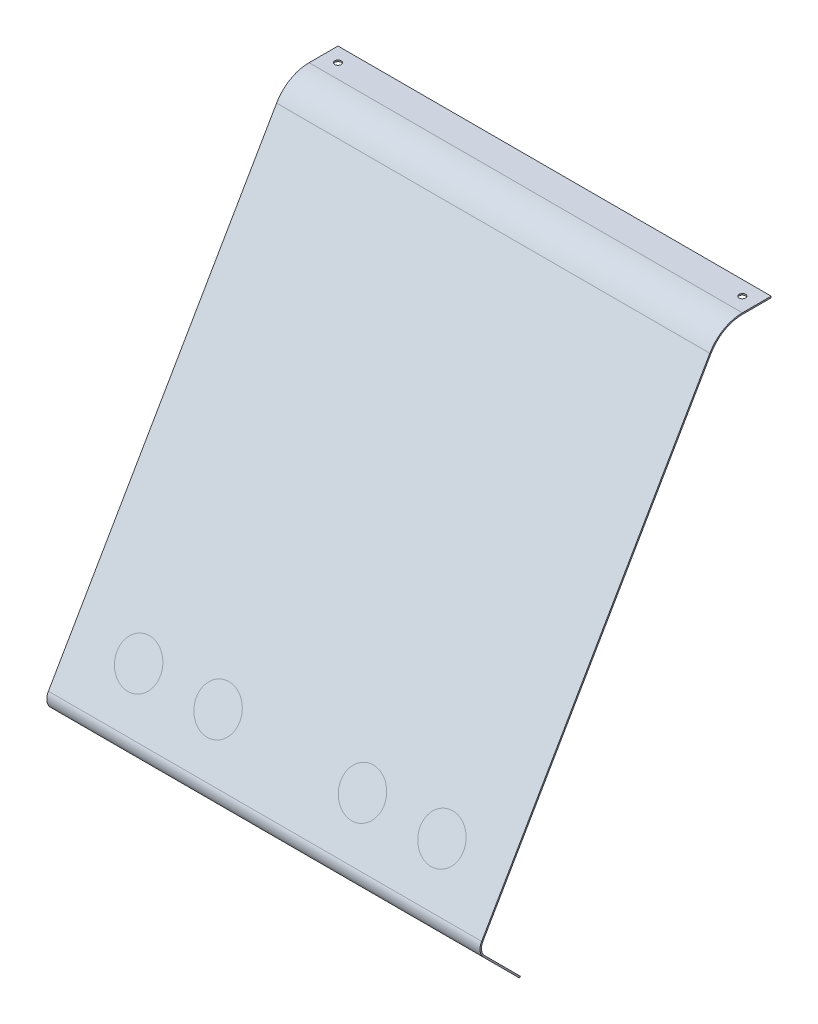
ISO-10303-21;
HEADER;
FILE_DESCRIPTION(('STEP AP214'),'2;1');
FILE_NAME('part.step','',(''),(''),'','','');
FILE_SCHEMA(('AUTOMOTIVE_DESIGN { 1 0 10303 214 1 1 1 1 }'));
ENDSEC;
DATA;
#1=APPLICATION_CONTEXT('core data for automotive mechanical design processes');
#2=APPLICATION_PROTOCOL_DEFINITION('international standard','automotive_design',2000,#1);
#3=PRODUCT_CONTEXT('',#1,'mechanical');
#4=PRODUCT('Part','Part','',(#3));
#5=PRODUCT_RELATED_PRODUCT_CATEGORY('part','',(#4));
#6=PRODUCT_DEFINITION_FORMATION('','',#4);
#7=PRODUCT_DEFINITION_CONTEXT('part definition',#1,'design');
#8=PRODUCT_DEFINITION('design','',#6,#7);
#9=PRODUCT_DEFINITION_SHAPE('','',#8);
#10=(LENGTH_UNIT() NAMED_UNIT(*) SI_UNIT(.MILLI.,.METRE.));
#11=(NAMED_UNIT(*) PLANE_ANGLE_UNIT() SI_UNIT($,.RADIAN.));
#12=(NAMED_UNIT(*) SI_UNIT($,.STERADIAN.) SOLID_ANGLE_UNIT());
#13=UNCERTAINTY_MEASURE_WITH_UNIT(LENGTH_MEASURE(1.E-05),#10,'distance_accuracy_value','');
#14=(GEOMETRIC_REPRESENTATION_CONTEXT(3) GLOBAL_UNCERTAINTY_ASSIGNED_CONTEXT((#13)) GLOBAL_UNIT_ASSIGNED_CONTEXT((#10,
#11,#12)) REPRESENTATION_CONTEXT('',''));
#15=CARTESIAN_POINT('',(0.,0.,0.));
#16=DIRECTION('',(0.,0.,1.));
#17=DIRECTION('',(1.,0.,0.));
#18=AXIS2_PLACEMENT_3D('',#15,#16,#17);
#19=CARTESIAN_POINT('',(0.,68.6719448082336,53.6811732369732));
#20=DIRECTION('',(0.,-0.499999999999998,-0.86602540378444));
#21=DIRECTION('',(0.,0.86602540378444,-0.499999999999998));
#22=AXIS2_PLACEMENT_3D('',#19,#20,#21);
#23=PLANE('',#22);
#24=DIRECTION('',(0.,0.86602540378444,-0.499999999999998));
#25=VECTOR('',#24,1.);
#26=CARTESIAN_POINT('',(600.,68.6719448082336,53.6811732369732));
#27=LINE('',#26,#25);
#28=CARTESIAN_POINT('',(600.,68.6719448082336,53.6811732369732));
#29=VERTEX_POINT('',#28);
#30=CARTESIAN_POINT('',(600.,616.,-262.318826763025));
#31=VERTEX_POINT('',#30);
#32=EDGE_CURVE('E497',#29,#31,#27,.T.);
#33=ORIENTED_EDGE('',*,*,#32,.T.);
#34=DIRECTION('',(1.,0.,0.));
#35=VECTOR('',#34,1.);
#36=CARTESIAN_POINT('',(0.,616.,-262.318826763025));
#37=LINE('',#36,#35);
#38=CARTESIAN_POINT('',(0.,616.,-262.318826763026));
#39=VERTEX_POINT('',#38);
#40=EDGE_CURVE('E498',#39,#31,#37,.T.);
#41=ORIENTED_EDGE('',*,*,#40,.F.);
#42=DIRECTION('',(0.,0.86602540378444,-0.499999999999998));
#43=VECTOR('',#42,1.);
#44=CARTESIAN_POINT('',(0.,68.6719448082336,53.6811732369732));
#45=LINE('',#44,#43);
#46=CARTESIAN_POINT('',(0.,68.6719448082336,53.6811732369732));
#47=VERTEX_POINT('',#46);
#48=EDGE_CURVE('E496',#47,#39,#45,.T.);
#49=ORIENTED_EDGE('',*,*,#48,.F.);
#50=DIRECTION('',(1.,0.,0.));
#51=VECTOR('',#50,1.);
#52=CARTESIAN_POINT('',(0.,68.6719448082336,53.6811732369732));
#53=LINE('',#52,#51);
#54=EDGE_CURVE('E493',#47,#29,#53,.T.);
#55=ORIENTED_EDGE('',*,*,#54,.T.);
#56=EDGE_LOOP('',(#33,#41,#49,#55));
#57=FACE_BOUND('',#56,.T.);
#58=CARTESIAN_POINT('',(90.,129.293723073144,18.6811732369734));
#59=DIRECTION('',(0.,-0.499999999999998,-0.86602540378444));
#60=DIRECTION('',(0.,0.86602540378444,-0.499999999999998));
#61=AXIS2_PLACEMENT_3D('',#58,#59,#60);
#62=CIRCLE('',#61,30.);
#63=CARTESIAN_POINT('',(90.,155.274485186678,3.68117323697342));
#64=VERTEX_POINT('',#63);
#65=EDGE_CURVE('E143',#64,#64,#62,.F.);
#66=ORIENTED_EDGE('',*,*,#65,.F.);
#67=EDGE_LOOP('',(#66));
#68=FACE_BOUND('',#67,.T.);
#69=CARTESIAN_POINT('',(200.,129.293723073144,18.6811732369734));
#70=DIRECTION('',(0.,-0.499999999999998,-0.86602540378444));
#71=DIRECTION('',(0.,0.86602540378444,-0.499999999999998));
#72=AXIS2_PLACEMENT_3D('',#69,#70,#71);
#73=CIRCLE('',#72,30.);
#74=CARTESIAN_POINT('',(200.,155.274485186678,3.68117323697342));
#75=VERTEX_POINT('',#74);
#76=EDGE_CURVE('E179',#75,#75,#73,.F.);
#77=ORIENTED_EDGE('',*,*,#76,.F.);
#78=EDGE_LOOP('',(#77));
#79=FACE_BOUND('',#78,.T.);
#80=CARTESIAN_POINT('',(510.,129.293723073144,18.6811732369734));
#81=DIRECTION('',(0.,-0.499999999999998,-0.86602540378444));
#82=DIRECTION('',(0.,0.86602540378444,-0.499999999999998));
#83=AXIS2_PLACEMENT_3D('',#80,#81,#82);
#84=CIRCLE('',#83,30.0000000000001);
#85=CARTESIAN_POINT('',(510.,155.274485186678,3.68117323697339));
#86=VERTEX_POINT('',#85);
#87=EDGE_CURVE('E63',#86,#86,#84,.F.);
#88=ORIENTED_EDGE('',*,*,#87,.F.);
#89=EDGE_LOOP('',(#88));
#90=FACE_BOUND('',#89,.T.);
#91=CARTESIAN_POINT('',(400.,129.293723073144,18.6811732369737));
#92=DIRECTION('',(0.,-0.499999999999998,-0.86602540378444));
#93=DIRECTION('',(0.,0.86602540378444,-0.499999999999998));
#94=AXIS2_PLACEMENT_3D('',#91,#92,#93);
#95=CIRCLE('',#94,30.0000000000001);
#96=CARTESIAN_POINT('',(400.,155.274485186677,3.68117323697378));
#97=VERTEX_POINT('',#96);
#98=EDGE_CURVE('E11',#97,#97,#95,.F.);
#99=ORIENTED_EDGE('',*,*,#98,.F.);
#100=EDGE_LOOP('',(#99));
#101=FACE_BOUND('',#100,.T.);
#102=ADVANCED_FACE('F53',(#57,#68,#79,#90,#101),#23,.F.);
#103=ORIENTED_EDGE('',*,*,#98,.T.);
#104=EDGE_LOOP('',(#103));
#105=FACE_BOUND('',#104,.T.);
#106=ADVANCED_FACE('F191',(#105),#23,.F.);
#107=ORIENTED_EDGE('',*,*,#87,.T.);
#108=EDGE_LOOP('',(#107));
#109=FACE_BOUND('',#108,.T.);
#110=ADVANCED_FACE('F187',(#109),#23,.F.);
#111=ORIENTED_EDGE('',*,*,#76,.T.);
#112=EDGE_LOOP('',(#111));
#113=FACE_BOUND('',#112,.T.);
#114=ADVANCED_FACE('F201',(#113),#23,.F.);
#115=CARTESIAN_POINT('',(0.,640.,-307.352147759817));
#116=DIRECTION('',(-1.,0.,0.));
#117=DIRECTION('',(0.,0.,-1.));
#118=AXIS2_PLACEMENT_3D('',#115,#116,#117);
#119=PLANE('',#118);
#120=DIRECTION('',(0.,0.,-1.));
#121=VECTOR('',#120,1.);
#122=CARTESIAN_POINT('',(0.,640.,-307.352147759817));
#123=LINE('',#122,#121);
#124=CARTESIAN_POINT('',(0.,640.,-307.352147759817));
#125=VERTEX_POINT('',#124);
#126=CARTESIAN_POINT('',(0.,640.,-347.352147759817));
#127=VERTEX_POINT('',#126);
#128=EDGE_CURVE('E546',#125,#127,#123,.T.);
#129=ORIENTED_EDGE('',*,*,#128,.F.);
#130=CARTESIAN_POINT('',(0.,590.,-307.352147759817));
#131=DIRECTION('',(-1.,0.,0.));
#132=DIRECTION('',(0.,0.,1.));
#133=AXIS2_PLACEMENT_3D('',#130,#131,#132);
#134=CIRCLE('',#133,50.0000000000003);
#135=CARTESIAN_POINT('',(0.,615.,-264.050877570594));
#136=VERTEX_POINT('',#135);
#137=EDGE_CURVE('E466',#136,#125,#134,.T.);
#138=ORIENTED_EDGE('',*,*,#137,.F.);
#139=DIRECTION('',(0.,0.86602540378444,-0.499999999999998));
#140=VECTOR('',#139,1.);
#141=CARTESIAN_POINT('',(0.,67.6719448082336,51.9491224294044));
#142=LINE('',#141,#140);
#143=CARTESIAN_POINT('',(0.,67.6719448082336,51.9491224294044));
#144=VERTEX_POINT('',#143);
#145=EDGE_CURVE('E470',#144,#136,#142,.T.);
#146=ORIENTED_EDGE('',*,*,#145,.F.);
#147=CARTESIAN_POINT('',(0.,60.1719448082336,38.9587413726378));
#148=DIRECTION('',(-1.,0.,0.));
#149=DIRECTION('',(0.,0.,-1.));
#150=AXIS2_PLACEMENT_3D('',#147,#148,#149);
#151=CIRCLE('',#150,15.);
#152=CARTESIAN_POINT('',(0.,49.5653430904353,49.5653430904359));
#153=VERTEX_POINT('',#152);
#154=EDGE_CURVE('E485',#153,#144,#151,.T.);
#155=ORIENTED_EDGE('',*,*,#154,.F.);
#156=DIRECTION('',(0.,0.707106781186543,0.707106781186552));
#157=VECTOR('',#156,1.);
#158=CARTESIAN_POINT('',(0.,0.,0.));
#159=LINE('',#158,#157);
#160=CARTESIAN_POINT('',(0.,0.,0.));
#161=VERTEX_POINT('',#160);
#162=EDGE_CURVE('E138',#161,#153,#159,.T.);
#163=ORIENTED_EDGE('',*,*,#162,.F.);
#164=DIRECTION('',(0.,0.707106781186552,-0.707106781186543));
#165=VECTOR('',#164,1.);
#166=CARTESIAN_POINT('',(0.,0.,0.));
#167=LINE('',#166,#165);
#168=CARTESIAN_POINT('',(0.,-1.4142135623731,1.41421356237309));
#169=VERTEX_POINT('',#168);
#170=EDGE_CURVE('E130',#169,#161,#167,.T.);
#171=ORIENTED_EDGE('',*,*,#170,.F.);
#172=DIRECTION('',(0.,0.707106781186543,0.707106781186552));
#173=VECTOR('',#172,1.);
#174=CARTESIAN_POINT('',(0.,-1.4142135623731,1.41421356237309));
#175=LINE('',#174,#173);
#176=CARTESIAN_POINT('',(0.,48.1511295280623,50.979556652809));
#177=VERTEX_POINT('',#176);
#178=EDGE_CURVE('E135',#169,#177,#175,.T.);
#179=ORIENTED_EDGE('',*,*,#178,.T.);
#180=CARTESIAN_POINT('',(0.,60.1719448082336,38.9587413726378));
#181=DIRECTION('',(1.,0.,0.));
#182=DIRECTION('',(0.,0.,-1.));
#183=AXIS2_PLACEMENT_3D('',#180,#181,#182);
#184=CIRCLE('',#183,17.);
#185=EDGE_CURVE('E166',#177,#47,#184,.F.);
#186=ORIENTED_EDGE('',*,*,#185,.T.);
#187=ORIENTED_EDGE('',*,*,#48,.T.);
#188=CARTESIAN_POINT('',(0.,590.,-307.352147759817));
#189=DIRECTION('',(1.,0.,0.));
#190=DIRECTION('',(0.,0.,-1.));
#191=AXIS2_PLACEMENT_3D('',#188,#189,#190);
#192=CIRCLE('',#191,52.0000000000003);
#193=CARTESIAN_POINT('',(0.,642.,-307.352147759817));
#194=VERTEX_POINT('',#193);
#195=EDGE_CURVE('E501',#39,#194,#192,.F.);
#196=ORIENTED_EDGE('',*,*,#195,.T.);
#197=DIRECTION('',(0.,0.,-1.));
#198=VECTOR('',#197,1.);
#199=CARTESIAN_POINT('',(0.,642.,-307.352147759817));
#200=LINE('',#199,#198);
#201=CARTESIAN_POINT('',(0.,642.,-347.352147759817));
#202=VERTEX_POINT('',#201);
#203=EDGE_CURVE('E506',#194,#202,#200,.T.);
#204=ORIENTED_EDGE('',*,*,#203,.T.);
#205=DIRECTION('',(0.,-1.,0.));
#206=VECTOR('',#205,1.);
#207=CARTESIAN_POINT('',(0.,640.,-347.352147759817));
#208=LINE('',#207,#206);
#209=EDGE_CURVE('E71',#202,#127,#208,.T.);
#210=ORIENTED_EDGE('',*,*,#209,.T.);
#211=EDGE_LOOP('',(#129,#138,#146,#155,#163,#171,#179,#186,#187,#196,#204,#210));
#212=FACE_BOUND('',#211,.T.);
#213=ADVANCED_FACE('F132',(#212),#119,.T.);
#214=CARTESIAN_POINT('',(0.,640.,-347.352147759817));
#215=DIRECTION('',(0.,0.,-1.));
#216=DIRECTION('',(1.,0.,0.));
#217=AXIS2_PLACEMENT_3D('',#214,#215,#216);
#218=PLANE('',#217);
#219=ORIENTED_EDGE('',*,*,#209,.F.);
#220=DIRECTION('',(1.,0.,0.));
#221=VECTOR('',#220,1.);
#222=CARTESIAN_POINT('',(0.,642.,-347.352147759817));
#223=LINE('',#222,#221);
#224=CARTESIAN_POINT('',(600.,642.,-347.352147759817));
#225=VERTEX_POINT('',#224);
#226=EDGE_CURVE('E519',#202,#225,#223,.T.);
#227=ORIENTED_EDGE('',*,*,#226,.T.);
#228=DIRECTION('',(0.,-1.,0.));
#229=VECTOR('',#228,1.);
#230=CARTESIAN_POINT('',(600.,640.,-347.352147759817));
#231=LINE('',#230,#229);
#232=CARTESIAN_POINT('',(600.,640.,-347.352147759817));
#233=VERTEX_POINT('',#232);
#234=EDGE_CURVE('E169',#225,#233,#231,.T.);
#235=ORIENTED_EDGE('',*,*,#234,.T.);
#236=DIRECTION('',(1.,0.,0.));
#237=VECTOR('',#236,1.);
#238=CARTESIAN_POINT('',(0.,640.,-347.352147759817));
#239=LINE('',#238,#237);
#240=EDGE_CURVE('E456',#127,#233,#239,.T.);
#241=ORIENTED_EDGE('',*,*,#240,.F.);
#242=EDGE_LOOP('',(#219,#227,#235,#241));
#243=FACE_BOUND('',#242,.T.);
#244=ADVANCED_FACE('F220',(#243),#218,.T.);
#245=CARTESIAN_POINT('',(600.,0.,0.));
#246=DIRECTION('',(-1.,0.,0.));
#247=DIRECTION('',(0.,0.707106781186543,0.707106781186552));
#248=AXIS2_PLACEMENT_3D('',#245,#246,#247);
#249=PLANE('',#248);
#250=DIRECTION('',(0.,0.707106781186543,0.707106781186552));
#251=VECTOR('',#250,1.);
#252=CARTESIAN_POINT('',(600.,0.,0.));
#253=LINE('',#252,#251);
#254=CARTESIAN_POINT('',(600.,0.,0.));
#255=VERTEX_POINT('',#254);
#256=CARTESIAN_POINT('',(600.,49.5653430904353,49.5653430904359));
#257=VERTEX_POINT('',#256);
#258=EDGE_CURVE('E489',#255,#257,#253,.T.);
#259=ORIENTED_EDGE('',*,*,#258,.T.);
#260=CARTESIAN_POINT('',(600.,60.1719448082336,38.9587413726378));
#261=DIRECTION('',(-1.,0.,0.));
#262=DIRECTION('',(0.,0.,-1.));
#263=AXIS2_PLACEMENT_3D('',#260,#261,#262);
#264=CIRCLE('',#263,15.);
#265=CARTESIAN_POINT('',(600.,67.6719448082336,51.9491224294044));
#266=VERTEX_POINT('',#265);
#267=EDGE_CURVE('E461',#257,#266,#264,.T.);
#268=ORIENTED_EDGE('',*,*,#267,.T.);
#269=DIRECTION('',(0.,0.86602540378444,-0.499999999999998));
#270=VECTOR('',#269,1.);
#271=CARTESIAN_POINT('',(600.,67.6719448082336,51.9491224294044));
#272=LINE('',#271,#270);
#273=CARTESIAN_POINT('',(600.,615.,-264.050877570594));
#274=VERTEX_POINT('',#273);
#275=EDGE_CURVE('E459',#266,#274,#272,.T.);
#276=ORIENTED_EDGE('',*,*,#275,.T.);
#277=CARTESIAN_POINT('',(600.,590.,-307.352147759817));
#278=DIRECTION('',(-1.,0.,0.));
#279=DIRECTION('',(0.,0.,1.));
#280=AXIS2_PLACEMENT_3D('',#277,#278,#279);
#281=CIRCLE('',#280,50.0000000000003);
#282=CARTESIAN_POINT('',(600.,640.,-307.352147759817));
#283=VERTEX_POINT('',#282);
#284=EDGE_CURVE('E450',#274,#283,#281,.T.);
#285=ORIENTED_EDGE('',*,*,#284,.T.);
#286=DIRECTION('',(0.,0.,-1.));
#287=VECTOR('',#286,1.);
#288=CARTESIAN_POINT('',(600.,640.,-307.352147759817));
#289=LINE('',#288,#287);
#290=EDGE_CURVE('E159',#283,#233,#289,.T.);
#291=ORIENTED_EDGE('',*,*,#290,.T.);
#292=ORIENTED_EDGE('',*,*,#234,.F.);
#293=DIRECTION('',(0.,0.,-1.));
#294=VECTOR('',#293,1.);
#295=CARTESIAN_POINT('',(600.,642.,-307.352147759817));
#296=LINE('',#295,#294);
#297=CARTESIAN_POINT('',(600.,642.,-307.352147759817));
#298=VERTEX_POINT('',#297);
#299=EDGE_CURVE('E507',#298,#225,#296,.T.);
#300=ORIENTED_EDGE('',*,*,#299,.F.);
#301=CARTESIAN_POINT('',(600.,590.,-307.352147759817));
#302=DIRECTION('',(1.,0.,0.));
#303=DIRECTION('',(0.,0.,-1.));
#304=AXIS2_PLACEMENT_3D('',#301,#302,#303);
#305=CIRCLE('',#304,52.0000000000003);
#306=EDGE_CURVE('E502',#31,#298,#305,.F.);
#307=ORIENTED_EDGE('',*,*,#306,.F.);
#308=ORIENTED_EDGE('',*,*,#32,.F.);
#309=CARTESIAN_POINT('',(600.,60.1719448082336,38.9587413726378));
#310=DIRECTION('',(1.,0.,0.));
#311=DIRECTION('',(0.,0.,-1.));
#312=AXIS2_PLACEMENT_3D('',#309,#310,#311);
#313=CIRCLE('',#312,17.);
#314=CARTESIAN_POINT('',(600.,48.1511295280622,50.979556652809));
#315=VERTEX_POINT('',#314);
#316=EDGE_CURVE('E492',#315,#29,#313,.F.);
#317=ORIENTED_EDGE('',*,*,#316,.F.);
#318=DIRECTION('',(0.,0.707106781186543,0.707106781186552));
#319=VECTOR('',#318,1.);
#320=CARTESIAN_POINT('',(600.,-1.4142135623731,1.41421356237309));
#321=LINE('',#320,#319);
#322=CARTESIAN_POINT('',(600.,-1.4142135623731,1.41421356237309));
#323=VERTEX_POINT('',#322);
#324=EDGE_CURVE('E153',#323,#315,#321,.T.);
#325=ORIENTED_EDGE('',*,*,#324,.F.);
#326=DIRECTION('',(0.,0.707106781186552,-0.707106781186543));
#327=VECTOR('',#326,1.);
#328=CARTESIAN_POINT('',(600.,0.,0.));
#329=LINE('',#328,#327);
#330=EDGE_CURVE('E148',#323,#255,#329,.T.);
#331=ORIENTED_EDGE('',*,*,#330,.T.);
#332=EDGE_LOOP('',(#259,#268,#276,#285,#291,#292,#300,#307,#308,#317,#325,#331));
#333=FACE_BOUND('',#332,.T.);
#334=ADVANCED_FACE('F217',(#333),#249,.F.);
#335=CARTESIAN_POINT('',(0.,0.,0.));
#336=DIRECTION('',(0.,0.707106781186543,0.707106781186552));
#337=DIRECTION('',(1.,0.,0.));
#338=AXIS2_PLACEMENT_3D('',#335,#336,#337);
#339=PLANE('',#338);
#340=DIRECTION('',(1.,0.,0.));
#341=VECTOR('',#340,1.);
#342=CARTESIAN_POINT('',(0.,-1.4142135623731,1.41421356237309));
#343=LINE('',#342,#341);
#344=EDGE_CURVE('E147',#169,#323,#343,.T.);
#345=ORIENTED_EDGE('',*,*,#344,.F.);
#346=ORIENTED_EDGE('',*,*,#170,.T.);
#347=DIRECTION('',(1.,0.,0.));
#348=VECTOR('',#347,1.);
#349=CARTESIAN_POINT('',(0.,0.,0.));
#350=LINE('',#349,#348);
#351=EDGE_CURVE('E486',#161,#255,#350,.T.);
#352=ORIENTED_EDGE('',*,*,#351,.T.);
#353=ORIENTED_EDGE('',*,*,#330,.F.);
#354=EDGE_LOOP('',(#345,#346,#352,#353));
#355=FACE_BOUND('',#354,.T.);
#356=ADVANCED_FACE('F55',(#355),#339,.F.);
#357=CARTESIAN_POINT('',(0.,0.,0.));
#358=DIRECTION('',(0.,0.707106781186552,-0.707106781186543));
#359=DIRECTION('',(0.,0.707106781186543,0.707106781186552));
#360=AXIS2_PLACEMENT_3D('',#357,#358,#359);
#361=PLANE('',#360);
#362=CARTESIAN_POINT('',(19.9999999999997,23.4023921865332,23.4023921865335));
#363=DIRECTION('',(0.,0.707106781186552,-0.707106781186543));
#364=DIRECTION('',(0.,0.707106781186543,0.707106781186552));
#365=AXIS2_PLACEMENT_3D('',#362,#363,#364);
#366=CIRCLE('',#365,4.49999999999991);
#367=CARTESIAN_POINT('',(19.9999999999997,26.5843727018726,26.5843727018729));
#368=VERTEX_POINT('',#367);
#369=EDGE_CURVE('E576',#368,#368,#366,.F.);
#370=ORIENTED_EDGE('',*,*,#369,.T.);
#371=EDGE_LOOP('',(#370));
#372=FACE_BOUND('',#371,.T.);
#373=CARTESIAN_POINT('',(580.,23.4023921865332,23.4023921865335));
#374=DIRECTION('',(0.,0.707106781186552,-0.707106781186543));
#375=DIRECTION('',(0.,0.707106781186543,0.707106781186552));
#376=AXIS2_PLACEMENT_3D('',#373,#374,#375);
#377=CIRCLE('',#376,4.49999999999991);
#378=CARTESIAN_POINT('',(580.,26.5843727018726,26.5843727018729));
#379=VERTEX_POINT('',#378);
#380=EDGE_CURVE('E523',#379,#379,#377,.F.);
#381=ORIENTED_EDGE('',*,*,#380,.T.);
#382=EDGE_LOOP('',(#381));
#383=FACE_BOUND('',#382,.T.);
#384=ORIENTED_EDGE('',*,*,#258,.F.);
#385=ORIENTED_EDGE('',*,*,#351,.F.);
#386=ORIENTED_EDGE('',*,*,#162,.T.);
#387=DIRECTION('',(1.,0.,0.));
#388=VECTOR('',#387,1.);
#389=CARTESIAN_POINT('',(0.,49.5653430904353,49.5653430904359));
#390=LINE('',#389,#388);
#391=EDGE_CURVE('E481',#153,#257,#390,.T.);
#392=ORIENTED_EDGE('',*,*,#391,.T.);
#393=EDGE_LOOP('',(#384,#385,#386,#392));
#394=FACE_BOUND('',#393,.T.);
#395=ADVANCED_FACE('F366',(#372,#383,#394),#361,.T.);
#396=CARTESIAN_POINT('',(0.,60.1719448082336,38.9587413726378));
#397=DIRECTION('',(1.,0.,0.));
#398=DIRECTION('',(0.,0.,-1.));
#399=AXIS2_PLACEMENT_3D('',#396,#397,#398);
#400=CYLINDRICAL_SURFACE('',#399,15.);
#401=ORIENTED_EDGE('',*,*,#267,.F.);
#402=ORIENTED_EDGE('',*,*,#391,.F.);
#403=ORIENTED_EDGE('',*,*,#154,.T.);
#404=DIRECTION('',(1.,0.,0.));
#405=VECTOR('',#404,1.);
#406=CARTESIAN_POINT('',(0.,67.6719448082336,51.9491224294044));
#407=LINE('',#406,#405);
#408=EDGE_CURVE('E465',#144,#266,#407,.T.);
#409=ORIENTED_EDGE('',*,*,#408,.T.);
#410=EDGE_LOOP('',(#401,#402,#403,#409));
#411=FACE_BOUND('',#410,.T.);
#412=ADVANCED_FACE('F369',(#411),#400,.F.);
#413=CARTESIAN_POINT('',(0.,67.6719448082336,51.9491224294044));
#414=DIRECTION('',(0.,-0.499999999999998,-0.86602540378444));
#415=DIRECTION('',(0.,0.86602540378444,-0.499999999999998));
#416=AXIS2_PLACEMENT_3D('',#413,#414,#415);
#417=PLANE('',#416);
#418=ORIENTED_EDGE('',*,*,#275,.F.);
#419=ORIENTED_EDGE('',*,*,#408,.F.);
#420=ORIENTED_EDGE('',*,*,#145,.T.);
#421=DIRECTION('',(1.,0.,0.));
#422=VECTOR('',#421,1.);
#423=CARTESIAN_POINT('',(0.,615.,-264.050877570594));
#424=LINE('',#423,#422);
#425=EDGE_CURVE('E453',#136,#274,#424,.T.);
#426=ORIENTED_EDGE('',*,*,#425,.T.);
#427=EDGE_LOOP('',(#418,#419,#420,#426));
#428=FACE_BOUND('',#427,.T.);
#429=ADVANCED_FACE('F424',(#428),#417,.T.);
#430=CARTESIAN_POINT('',(0.,590.,-307.352147759817));
#431=DIRECTION('',(1.,0.,0.));
#432=DIRECTION('',(0.,0.,-1.));
#433=AXIS2_PLACEMENT_3D('',#430,#431,#432);
#434=CYLINDRICAL_SURFACE('',#433,50.0000000000003);
#435=ORIENTED_EDGE('',*,*,#284,.F.);
#436=ORIENTED_EDGE('',*,*,#425,.F.);
#437=ORIENTED_EDGE('',*,*,#137,.T.);
#438=DIRECTION('',(1.,0.,0.));
#439=VECTOR('',#438,1.);
#440=CARTESIAN_POINT('',(0.,640.,-307.352147759817));
#441=LINE('',#440,#439);
#442=EDGE_CURVE('E163',#125,#283,#441,.T.);
#443=ORIENTED_EDGE('',*,*,#442,.T.);
#444=EDGE_LOOP('',(#435,#436,#437,#443));
#445=FACE_BOUND('',#444,.T.);
#446=ADVANCED_FACE('F359',(#445),#434,.F.);
#447=CARTESIAN_POINT('',(0.,640.,-307.352147759817));
#448=DIRECTION('',(0.,-1.,0.));
#449=DIRECTION('',(0.,0.,-1.));
#450=AXIS2_PLACEMENT_3D('',#447,#448,#449);
#451=PLANE('',#450);
#452=CARTESIAN_POINT('',(19.9999999999997,640.,-327.352147759817));
#453=DIRECTION('',(0.,-1.,0.));
#454=DIRECTION('',(0.,0.,-1.));
#455=AXIS2_PLACEMENT_3D('',#452,#453,#454);
#456=CIRCLE('',#455,4.49999999999991);
#457=CARTESIAN_POINT('',(19.9999999999997,640.,-331.852147759817));
#458=VERTEX_POINT('',#457);
#459=EDGE_CURVE('E584',#458,#458,#456,.F.);
#460=ORIENTED_EDGE('',*,*,#459,.T.);
#461=EDGE_LOOP('',(#460));
#462=FACE_BOUND('',#461,.T.);
#463=CARTESIAN_POINT('',(580.,640.,-327.352147759817));
#464=DIRECTION('',(0.,-1.,0.));
#465=DIRECTION('',(0.,0.,-1.));
#466=AXIS2_PLACEMENT_3D('',#463,#464,#465);
#467=CIRCLE('',#466,4.49999999999991);
#468=CARTESIAN_POINT('',(580.,640.,-331.852147759817));
#469=VERTEX_POINT('',#468);
#470=EDGE_CURVE('E568',#469,#469,#467,.F.);
#471=ORIENTED_EDGE('',*,*,#470,.T.);
#472=EDGE_LOOP('',(#471));
#473=FACE_BOUND('',#472,.T.);
#474=ORIENTED_EDGE('',*,*,#290,.F.);
#475=ORIENTED_EDGE('',*,*,#442,.F.);
#476=ORIENTED_EDGE('',*,*,#128,.T.);
#477=ORIENTED_EDGE('',*,*,#240,.T.);
#478=EDGE_LOOP('',(#474,#475,#476,#477));
#479=FACE_BOUND('',#478,.T.);
#480=ADVANCED_FACE('F352',(#462,#473,#479),#451,.T.);
#481=CARTESIAN_POINT('',(0.,-1.4142135623731,1.41421356237309));
#482=DIRECTION('',(0.,0.707106781186552,-0.707106781186543));
#483=DIRECTION('',(0.,0.707106781186543,0.707106781186552));
#484=AXIS2_PLACEMENT_3D('',#481,#482,#483);
#485=PLANE('',#484);
#486=CARTESIAN_POINT('',(19.9999999999997,21.9881786241601,24.8166057489066));
#487=DIRECTION('',(0.,-0.707106781186552,0.707106781186543));
#488=DIRECTION('',(0.,-0.707106781186543,-0.707106781186552));
#489=AXIS2_PLACEMENT_3D('',#486,#487,#488);
#490=CIRCLE('',#489,4.49999999999991);
#491=CARTESIAN_POINT('',(19.9999999999997,18.8061981088208,21.6346252335672));
#492=VERTEX_POINT('',#491);
#493=EDGE_CURVE('E580',#492,#492,#490,.T.);
#494=ORIENTED_EDGE('',*,*,#493,.F.);
#495=EDGE_LOOP('',(#494));
#496=FACE_BOUND('',#495,.T.);
#497=CARTESIAN_POINT('',(580.,21.9881786241601,24.8166057489066));
#498=DIRECTION('',(0.,-0.707106781186552,0.707106781186543));
#499=DIRECTION('',(0.,-0.707106781186543,-0.707106781186552));
#500=AXIS2_PLACEMENT_3D('',#497,#498,#499);
#501=CIRCLE('',#500,4.49999999999991);
#502=CARTESIAN_POINT('',(580.,18.8061981088208,21.6346252335672));
#503=VERTEX_POINT('',#502);
#504=EDGE_CURVE('E564',#503,#503,#501,.T.);
#505=ORIENTED_EDGE('',*,*,#504,.F.);
#506=EDGE_LOOP('',(#505));
#507=FACE_BOUND('',#506,.T.);
#508=ORIENTED_EDGE('',*,*,#324,.T.);
#509=DIRECTION('',(1.,0.,0.));
#510=VECTOR('',#509,1.);
#511=CARTESIAN_POINT('',(0.,48.1511295280622,50.979556652809));
#512=LINE('',#511,#510);
#513=EDGE_CURVE('E156',#177,#315,#512,.T.);
#514=ORIENTED_EDGE('',*,*,#513,.F.);
#515=ORIENTED_EDGE('',*,*,#178,.F.);
#516=ORIENTED_EDGE('',*,*,#344,.T.);
#517=EDGE_LOOP('',(#508,#514,#515,#516));
#518=FACE_BOUND('',#517,.T.);
#519=ADVANCED_FACE('F155',(#496,#507,#518),#485,.F.);
#520=CARTESIAN_POINT('',(0.,60.1719448082336,38.9587413726378));
#521=DIRECTION('',(1.,0.,0.));
#522=DIRECTION('',(0.,0.,-1.));
#523=AXIS2_PLACEMENT_3D('',#520,#521,#522);
#524=CYLINDRICAL_SURFACE('',#523,17.);
#525=ORIENTED_EDGE('',*,*,#316,.T.);
#526=ORIENTED_EDGE('',*,*,#54,.F.);
#527=ORIENTED_EDGE('',*,*,#185,.F.);
#528=ORIENTED_EDGE('',*,*,#513,.T.);
#529=EDGE_LOOP('',(#525,#526,#527,#528));
#530=FACE_BOUND('',#529,.T.);
#531=ADVANCED_FACE('F206',(#530),#524,.T.);
#532=ORIENTED_EDGE('',*,*,#65,.T.);
#533=EDGE_LOOP('',(#532));
#534=FACE_BOUND('',#533,.T.);
#535=ADVANCED_FACE('F194',(#534),#23,.F.);
#536=CARTESIAN_POINT('',(0.,590.,-307.352147759817));
#537=DIRECTION('',(1.,0.,0.));
#538=DIRECTION('',(0.,0.,-1.));
#539=AXIS2_PLACEMENT_3D('',#536,#537,#538);
#540=CYLINDRICAL_SURFACE('',#539,52.0000000000003);
#541=ORIENTED_EDGE('',*,*,#306,.T.);
#542=DIRECTION('',(1.,0.,0.));
#543=VECTOR('',#542,1.);
#544=CARTESIAN_POINT('',(0.,642.,-307.352147759817));
#545=LINE('',#544,#543);
#546=EDGE_CURVE('E503',#194,#298,#545,.T.);
#547=ORIENTED_EDGE('',*,*,#546,.F.);
#548=ORIENTED_EDGE('',*,*,#195,.F.);
#549=ORIENTED_EDGE('',*,*,#40,.T.);
#550=EDGE_LOOP('',(#541,#547,#548,#549));
#551=FACE_BOUND('',#550,.T.);
#552=ADVANCED_FACE('F205',(#551),#540,.T.);
#553=CARTESIAN_POINT('',(0.,642.,-307.352147759817));
#554=DIRECTION('',(0.,-1.,0.));
#555=DIRECTION('',(0.,0.,-1.));
#556=AXIS2_PLACEMENT_3D('',#553,#554,#555);
#557=PLANE('',#556);
#558=CARTESIAN_POINT('',(19.9999999999997,642.,-327.352147759817));
#559=DIRECTION('',(0.,1.,0.));
#560=DIRECTION('',(0.,0.,1.));
#561=AXIS2_PLACEMENT_3D('',#558,#559,#560);
#562=CIRCLE('',#561,4.49999999999991);
#563=CARTESIAN_POINT('',(19.9999999999997,642.,-322.852147759817));
#564=VERTEX_POINT('',#563);
#565=EDGE_CURVE('E588',#564,#564,#562,.T.);
#566=ORIENTED_EDGE('',*,*,#565,.F.);
#567=EDGE_LOOP('',(#566));
#568=FACE_BOUND('',#567,.T.);
#569=CARTESIAN_POINT('',(580.,642.,-327.352147759817));
#570=DIRECTION('',(0.,1.,0.));
#571=DIRECTION('',(0.,0.,1.));
#572=AXIS2_PLACEMENT_3D('',#569,#570,#571);
#573=CIRCLE('',#572,4.49999999999991);
#574=CARTESIAN_POINT('',(580.,642.,-322.852147759817));
#575=VERTEX_POINT('',#574);
#576=EDGE_CURVE('E572',#575,#575,#573,.T.);
#577=ORIENTED_EDGE('',*,*,#576,.F.);
#578=EDGE_LOOP('',(#577));
#579=FACE_BOUND('',#578,.T.);
#580=ORIENTED_EDGE('',*,*,#299,.T.);
#581=ORIENTED_EDGE('',*,*,#226,.F.);
#582=ORIENTED_EDGE('',*,*,#203,.F.);
#583=ORIENTED_EDGE('',*,*,#546,.T.);
#584=EDGE_LOOP('',(#580,#581,#582,#583));
#585=FACE_BOUND('',#584,.T.);
#586=ADVANCED_FACE('F211',(#568,#579,#585),#557,.F.);
#587=CARTESIAN_POINT('',(580.,32.4023921865332,14.4023921865337));
#588=DIRECTION('',(0.,-0.707106781186552,0.707106781186543));
#589=DIRECTION('',(0.,-0.707106781186543,-0.707106781186552));
#590=AXIS2_PLACEMENT_3D('',#587,#588,#589);
#591=CYLINDRICAL_SURFACE('',#590,4.49999999999991);
#592=ORIENTED_EDGE('',*,*,#504,.T.);
#593=EDGE_LOOP('',(#592));
#594=FACE_BOUND('',#593,.T.);
#595=ORIENTED_EDGE('',*,*,#380,.F.);
#596=EDGE_LOOP('',(#595));
#597=FACE_BOUND('',#596,.T.);
#598=ADVANCED_FACE('F215',(#594,#597),#591,.F.);
#599=CARTESIAN_POINT('',(580.,627.272077938642,-327.352147759817));
#600=DIRECTION('',(0.,1.,0.));
#601=DIRECTION('',(0.,0.,1.));
#602=AXIS2_PLACEMENT_3D('',#599,#600,#601);
#603=CYLINDRICAL_SURFACE('',#602,4.49999999999991);
#604=ORIENTED_EDGE('',*,*,#576,.T.);
#605=EDGE_LOOP('',(#604));
#606=FACE_BOUND('',#605,.T.);
#607=ORIENTED_EDGE('',*,*,#470,.F.);
#608=EDGE_LOOP('',(#607));
#609=FACE_BOUND('',#608,.T.);
#610=ADVANCED_FACE('F302',(#606,#609),#603,.F.);
#611=CARTESIAN_POINT('',(19.9999999999997,32.4023921865331,14.4023921865338));
#612=DIRECTION('',(0.,-0.707106781186552,0.707106781186543));
#613=DIRECTION('',(0.,-0.707106781186543,-0.707106781186552));
#614=AXIS2_PLACEMENT_3D('',#611,#612,#613);
#615=CYLINDRICAL_SURFACE('',#614,4.49999999999991);
#616=ORIENTED_EDGE('',*,*,#493,.T.);
#617=EDGE_LOOP('',(#616));
#618=FACE_BOUND('',#617,.T.);
#619=ORIENTED_EDGE('',*,*,#369,.F.);
#620=EDGE_LOOP('',(#619));
#621=FACE_BOUND('',#620,.T.);
#622=ADVANCED_FACE('F311',(#618,#621),#615,.F.);
#623=CARTESIAN_POINT('',(19.9999999999997,627.272077938642,-327.352147759817));
#624=DIRECTION('',(0.,1.,0.));
#625=DIRECTION('',(0.,0.,1.));
#626=AXIS2_PLACEMENT_3D('',#623,#624,#625);
#627=CYLINDRICAL_SURFACE('',#626,4.49999999999991);
#628=ORIENTED_EDGE('',*,*,#565,.T.);
#629=EDGE_LOOP('',(#628));
#630=FACE_BOUND('',#629,.T.);
#631=ORIENTED_EDGE('',*,*,#459,.F.);
#632=EDGE_LOOP('',(#631));
#633=FACE_BOUND('',#632,.T.);
#634=ADVANCED_FACE('F319',(#630,#633),#627,.F.);
#635=CLOSED_SHELL('',(#102,#106,#110,#114,#213,#244,#334,#356,#395,#412,#429,#446,#480,#519,
#531,#535,#552,#586,#598,#610,#622,#634));
#636=MANIFOLD_SOLID_BREP('B2',#635);
#637=ADVANCED_BREP_SHAPE_REPRESENTATION('',(#18,#636),#14);
#638=SHAPE_DEFINITION_REPRESENTATION(#9,#637);
ENDSEC;
END-ISO-10303-21;
